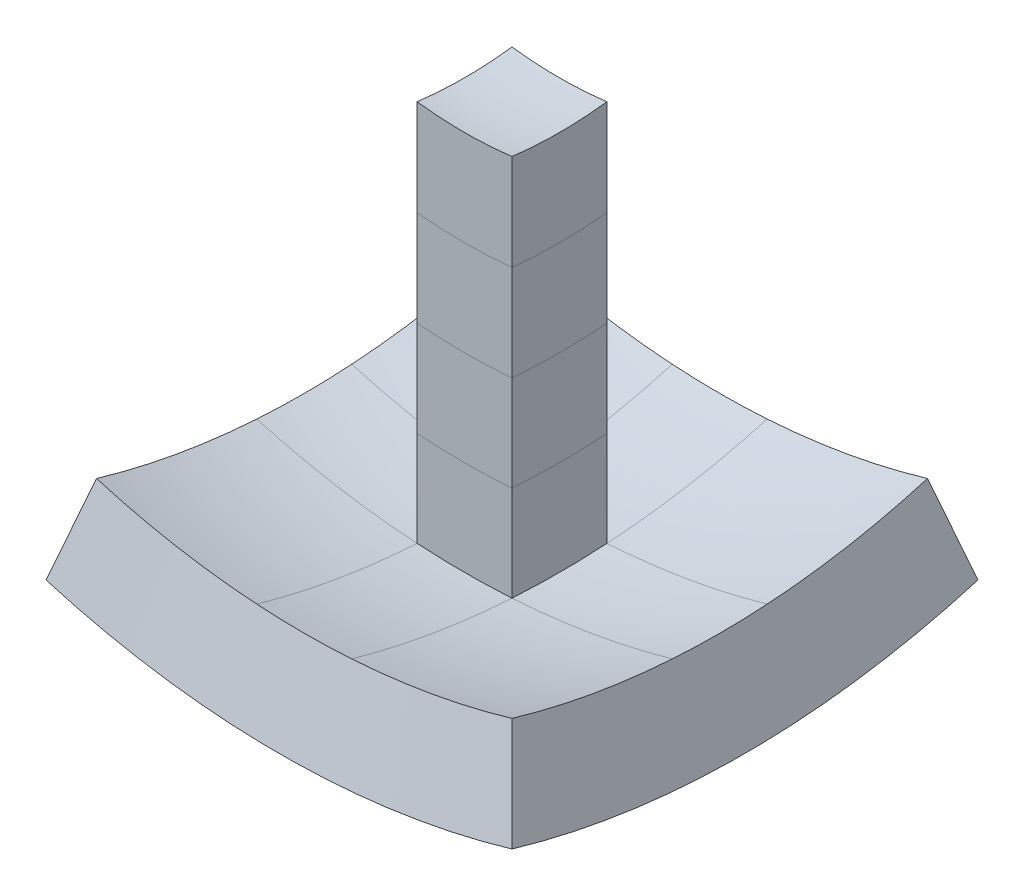
ISO-10303-21;
HEADER;
FILE_DESCRIPTION(('STEP AP214'),'2;1');
FILE_NAME('part.step','',(''),(''),'','','');
FILE_SCHEMA(('AUTOMOTIVE_DESIGN { 1 0 10303 214 1 1 1 1 }'));
ENDSEC;
DATA;
#1=APPLICATION_CONTEXT('core data for automotive mechanical design processes');
#2=APPLICATION_PROTOCOL_DEFINITION('international standard','automotive_design',2000,#1);
#3=PRODUCT_CONTEXT('',#1,'mechanical');
#4=PRODUCT('Part','Part','',(#3));
#5=PRODUCT_RELATED_PRODUCT_CATEGORY('part','',(#4));
#6=PRODUCT_DEFINITION_FORMATION('','',#4);
#7=PRODUCT_DEFINITION_CONTEXT('part definition',#1,'design');
#8=PRODUCT_DEFINITION('design','',#6,#7);
#9=PRODUCT_DEFINITION_SHAPE('','',#8);
#10=(LENGTH_UNIT() NAMED_UNIT(*) SI_UNIT(.MILLI.,.METRE.));
#11=(NAMED_UNIT(*) PLANE_ANGLE_UNIT() SI_UNIT($,.RADIAN.));
#12=(NAMED_UNIT(*) SI_UNIT($,.STERADIAN.) SOLID_ANGLE_UNIT());
#13=UNCERTAINTY_MEASURE_WITH_UNIT(LENGTH_MEASURE(1.E-05),#10,'distance_accuracy_value','');
#14=(GEOMETRIC_REPRESENTATION_CONTEXT(3) GLOBAL_UNCERTAINTY_ASSIGNED_CONTEXT((#13)) GLOBAL_UNIT_ASSIGNED_CONTEXT((#10,
#11,#12)) REPRESENTATION_CONTEXT('',''));
#15=CARTESIAN_POINT('',(0.,0.,0.));
#16=DIRECTION('',(0.,0.,1.));
#17=DIRECTION('',(1.,0.,0.));
#18=AXIS2_PLACEMENT_3D('',#15,#16,#17);
#19=CARTESIAN_POINT('',(0.,0.,0.));
#20=DIRECTION('',(0.,0.,1.));
#21=DIRECTION('',(1.,0.,0.));
#22=AXIS2_PLACEMENT_3D('',#19,#20,#21);
#23=SPHERICAL_SURFACE('',#22,30.7476736735782);
#24=CARTESIAN_POINT('',(0.,0.,3.8947960584419));
#25=DIRECTION('',(0.,0.,1.));
#26=DIRECTION('',(-1.,0.,0.));
#27=AXIS2_PLACEMENT_3D('',#24,#25,#26);
#28=CIRCLE('',#27,30.5);
#29=CARTESIAN_POINT('',(-8.39306295221711,-29.3224571664811,3.8947960584418));
#30=VERTEX_POINT('',#29);
#31=CARTESIAN_POINT('',(-3.89479605844179,-30.2502985714711,3.8947960584418));
#32=VERTEX_POINT('',#31);
#33=EDGE_CURVE('E314',#30,#32,#28,.T.);
#34=ORIENTED_EDGE('',*,*,#33,.T.);
#35=CARTESIAN_POINT('',(-3.8947960584419,0.,0.));
#36=DIRECTION('',(-1.,0.,0.));
#37=DIRECTION('',(0.,-1.,0.));
#38=AXIS2_PLACEMENT_3D('',#35,#36,#37);
#39=CIRCLE('',#38,30.5);
#40=CARTESIAN_POINT('',(-3.8947960584418,-29.3224571664811,8.39306295221711));
#41=VERTEX_POINT('',#40);
#42=EDGE_CURVE('E49',#32,#41,#39,.T.);
#43=ORIENTED_EDGE('',*,*,#42,.T.);
#44=CARTESIAN_POINT('',(0.,0.,8.39306295221721));
#45=DIRECTION('',(0.,0.,1.));
#46=DIRECTION('',(-1.,0.,0.));
#47=AXIS2_PLACEMENT_3D('',#44,#45,#46);
#48=CIRCLE('',#47,29.5799920658706);
#49=CARTESIAN_POINT('',(-8.39306295221712,-28.3642807928756,8.39306295221711));
#50=VERTEX_POINT('',#49);
#51=EDGE_CURVE('E113',#50,#41,#48,.T.);
#52=ORIENTED_EDGE('',*,*,#51,.F.);
#53=CARTESIAN_POINT('',(-8.39306295221722,0.,0.));
#54=DIRECTION('',(1.,0.,0.));
#55=DIRECTION('',(0.,1.,0.));
#56=AXIS2_PLACEMENT_3D('',#53,#54,#55);
#57=CIRCLE('',#56,29.5799920658707);
#58=EDGE_CURVE('E127',#50,#30,#57,.T.);
#59=ORIENTED_EDGE('',*,*,#58,.T.);
#60=EDGE_LOOP('',(#34,#43,#52,#59));
#61=FACE_BOUND('',#60,.T.);
#62=ADVANCED_FACE('F37',(#61),#23,.T.);
#63=CARTESIAN_POINT('',(32.5,0.,3.894796058442));
#64=DIRECTION('',(0.,0.,1.));
#65=DIRECTION('',(-1.,0.,0.));
#66=AXIS2_PLACEMENT_3D('',#63,#64,#65);
#67=PLANE('',#66);
#68=DIRECTION('',(-1.,0.,0.));
#69=VECTOR('',#68,1.);
#70=CARTESIAN_POINT('',(-32.5,-32.5,3.89479605844188));
#71=LINE('',#70,#69);
#72=CARTESIAN_POINT('',(3.8947960584421,-32.5,3.8947960584418));
#73=VERTEX_POINT('',#72);
#74=CARTESIAN_POINT('',(-3.89479605844188,-32.5,3.8947960584418));
#75=VERTEX_POINT('',#74);
#76=EDGE_CURVE('E616',#73,#75,#71,.T.);
#77=ORIENTED_EDGE('',*,*,#76,.F.);
#78=DIRECTION('',(0.,1.,0.));
#79=VECTOR('',#78,1.);
#80=CARTESIAN_POINT('',(3.89479605844199,-1.07552855510562E-13,3.89479605844199));
#81=LINE('',#80,#79);
#82=CARTESIAN_POINT('',(3.894796058442,-30.250298571471,3.8947960584418));
#83=VERTEX_POINT('',#82);
#84=EDGE_CURVE('E480',#73,#83,#81,.T.);
#85=ORIENTED_EDGE('',*,*,#84,.T.);
#86=EDGE_CURVE('E315',#32,#83,#28,.T.);
#87=ORIENTED_EDGE('',*,*,#86,.F.);
#88=DIRECTION('',(0.,-1.,0.));
#89=VECTOR('',#88,1.);
#90=CARTESIAN_POINT('',(-3.89479605844199,-1.45716771982052E-13,3.89479605844199));
#91=LINE('',#90,#89);
#92=EDGE_CURVE('E139',#32,#75,#91,.T.);
#93=ORIENTED_EDGE('',*,*,#92,.T.);
#94=EDGE_LOOP('',(#77,#85,#87,#93));
#95=FACE_BOUND('',#94,.T.);
#96=ADVANCED_FACE('F250',(#95),#67,.T.);
#97=CARTESIAN_POINT('',(3.89479605844189,32.5,0.));
#98=DIRECTION('',(1.,0.,0.));
#99=DIRECTION('',(0.,-1.,0.));
#100=AXIS2_PLACEMENT_3D('',#97,#98,#99);
#101=PLANE('',#100);
#102=DIRECTION('',(0.,0.,1.));
#103=VECTOR('',#102,1.);
#104=CARTESIAN_POINT('',(3.8947960584421,-32.5,-32.5));
#105=LINE('',#104,#103);
#106=CARTESIAN_POINT('',(3.89479605844201,-32.5,-3.89479605844211));
#107=VERTEX_POINT('',#106);
#108=EDGE_CURVE('E544',#107,#73,#105,.T.);
#109=ORIENTED_EDGE('',*,*,#108,.F.);
#110=DIRECTION('',(0.,-1.,0.));
#111=VECTOR('',#110,1.);
#112=CARTESIAN_POINT('',(3.89479605844199,0.,-3.89479605844199));
#113=LINE('',#112,#111);
#114=CARTESIAN_POINT('',(3.894796058442,-30.250298571471,-3.89479605844201));
#115=VERTEX_POINT('',#114);
#116=EDGE_CURVE('E404',#115,#107,#113,.T.);
#117=ORIENTED_EDGE('',*,*,#116,.F.);
#118=CARTESIAN_POINT('',(3.8947960584419,0.,0.));
#119=DIRECTION('',(-1.,0.,0.));
#120=DIRECTION('',(0.,-1.,0.));
#121=AXIS2_PLACEMENT_3D('',#118,#119,#120);
#122=CIRCLE('',#121,30.5);
#123=EDGE_CURVE('E142',#115,#83,#122,.T.);
#124=ORIENTED_EDGE('',*,*,#123,.T.);
#125=ORIENTED_EDGE('',*,*,#84,.F.);
#126=EDGE_LOOP('',(#109,#117,#124,#125));
#127=FACE_BOUND('',#126,.T.);
#128=ADVANCED_FACE('F258',(#127),#101,.T.);
#129=ORIENTED_EDGE('',*,*,#42,.F.);
#130=ORIENTED_EDGE('',*,*,#86,.T.);
#131=CARTESIAN_POINT('',(3.894796058442,-29.3224571664811,8.39306295221711));
#132=VERTEX_POINT('',#131);
#133=EDGE_CURVE('E134',#83,#132,#122,.T.);
#134=ORIENTED_EDGE('',*,*,#133,.T.);
#135=EDGE_CURVE('E57',#41,#132,#48,.T.);
#136=ORIENTED_EDGE('',*,*,#135,.F.);
#137=EDGE_LOOP('',(#129,#130,#134,#136));
#138=FACE_BOUND('',#137,.T.);
#139=ADVANCED_FACE('F264',(#138),#23,.T.);
#140=CARTESIAN_POINT('',(-3.89479605844211,32.5,0.));
#141=DIRECTION('',(-1.,0.,0.));
#142=DIRECTION('',(0.,-1.,0.));
#143=AXIS2_PLACEMENT_3D('',#140,#141,#142);
#144=PLANE('',#143);
#145=DIRECTION('',(0.,0.,-1.));
#146=VECTOR('',#145,1.);
#147=CARTESIAN_POINT('',(-3.89479605844188,-32.5,-32.5));
#148=LINE('',#147,#146);
#149=CARTESIAN_POINT('',(-3.89479605844183,-32.5,-3.89479605844211));
#150=VERTEX_POINT('',#149);
#151=EDGE_CURVE('E545',#75,#150,#148,.T.);
#152=ORIENTED_EDGE('',*,*,#151,.F.);
#153=ORIENTED_EDGE('',*,*,#92,.F.);
#154=CARTESIAN_POINT('',(-3.89479605844188,-30.250298571471,-3.89479605844201));
#155=VERTEX_POINT('',#154);
#156=EDGE_CURVE('E11',#155,#32,#39,.T.);
#157=ORIENTED_EDGE('',*,*,#156,.F.);
#158=DIRECTION('',(0.,1.,0.));
#159=VECTOR('',#158,1.);
#160=CARTESIAN_POINT('',(-3.89479605844199,-1.21430643318376E-13,-3.89479605844199));
#161=LINE('',#160,#159);
#162=EDGE_CURVE('E406',#150,#155,#161,.T.);
#163=ORIENTED_EDGE('',*,*,#162,.F.);
#164=EDGE_LOOP('',(#152,#153,#157,#163));
#165=FACE_BOUND('',#164,.T.);
#166=ADVANCED_FACE('F261',(#165),#144,.T.);
#167=CARTESIAN_POINT('',(0.,0.,0.));
#168=DIRECTION('',(-1.,0.,0.));
#169=DIRECTION('',(0.,1.,0.));
#170=AXIS2_PLACEMENT_3D('',#167,#168,#169);
#171=SPHERICAL_SURFACE('',#170,30.7476736735782);
#172=CARTESIAN_POINT('',(0.,0.,-3.8947960584419));
#173=DIRECTION('',(0.,0.,1.));
#174=DIRECTION('',(-1.,0.,0.));
#175=AXIS2_PLACEMENT_3D('',#172,#173,#174);
#176=CIRCLE('',#175,30.5);
#177=CARTESIAN_POINT('',(-8.39306295221711,-29.3224571664811,-3.894796058442));
#178=VERTEX_POINT('',#177);
#179=EDGE_CURVE('E329',#178,#155,#176,.T.);
#180=ORIENTED_EDGE('',*,*,#179,.T.);
#181=ORIENTED_EDGE('',*,*,#156,.T.);
#182=ORIENTED_EDGE('',*,*,#33,.F.);
#183=CARTESIAN_POINT('',(-8.39306295221721,0.,0.));
#184=DIRECTION('',(-1.,0.,0.));
#185=DIRECTION('',(0.,-1.,0.));
#186=AXIS2_PLACEMENT_3D('',#183,#184,#185);
#187=CIRCLE('',#186,29.5799920658706);
#188=EDGE_CURVE('E47',#178,#30,#187,.T.);
#189=ORIENTED_EDGE('',*,*,#188,.F.);
#190=EDGE_LOOP('',(#180,#181,#182,#189));
#191=FACE_BOUND('',#190,.T.);
#192=ADVANCED_FACE('F207',(#191),#171,.T.);
#193=CARTESIAN_POINT('',(32.5,0.,-3.894796058442));
#194=DIRECTION('',(0.,0.,-1.));
#195=DIRECTION('',(-1.,0.,0.));
#196=AXIS2_PLACEMENT_3D('',#193,#194,#195);
#197=PLANE('',#196);
#198=DIRECTION('',(1.,0.,0.));
#199=VECTOR('',#198,1.);
#200=CARTESIAN_POINT('',(-32.5,-32.5,-3.8947960584421));
#201=LINE('',#200,#199);
#202=EDGE_CURVE('E356',#150,#107,#201,.T.);
#203=ORIENTED_EDGE('',*,*,#202,.F.);
#204=ORIENTED_EDGE('',*,*,#162,.T.);
#205=EDGE_CURVE('E326',#155,#115,#176,.T.);
#206=ORIENTED_EDGE('',*,*,#205,.T.);
#207=ORIENTED_EDGE('',*,*,#116,.T.);
#208=EDGE_LOOP('',(#203,#204,#206,#207));
#209=FACE_BOUND('',#208,.T.);
#210=ADVANCED_FACE('F255',(#209),#197,.T.);
#211=CARTESIAN_POINT('',(0.,0.,0.));
#212=DIRECTION('',(1.,0.,0.));
#213=DIRECTION('',(0.,1.,0.));
#214=AXIS2_PLACEMENT_3D('',#211,#212,#213);
#215=SPHERICAL_SURFACE('',#214,30.7476736735782);
#216=CARTESIAN_POINT('',(8.39306295221732,-29.322457166481,-3.89479605844201));
#217=VERTEX_POINT('',#216);
#218=EDGE_CURVE('E330',#115,#217,#176,.T.);
#219=ORIENTED_EDGE('',*,*,#218,.T.);
#220=CARTESIAN_POINT('',(8.39306295221721,0.,0.));
#221=DIRECTION('',(-1.,0.,0.));
#222=DIRECTION('',(0.,-1.,0.));
#223=AXIS2_PLACEMENT_3D('',#220,#221,#222);
#224=CIRCLE('',#223,29.5799920658706);
#225=CARTESIAN_POINT('',(8.3930629522173,-29.322457166481,3.8947960584418));
#226=VERTEX_POINT('',#225);
#227=EDGE_CURVE('E307',#217,#226,#224,.T.);
#228=ORIENTED_EDGE('',*,*,#227,.T.);
#229=EDGE_CURVE('E122',#83,#226,#28,.T.);
#230=ORIENTED_EDGE('',*,*,#229,.F.);
#231=ORIENTED_EDGE('',*,*,#123,.F.);
#232=EDGE_LOOP('',(#219,#228,#230,#231));
#233=FACE_BOUND('',#232,.T.);
#234=ADVANCED_FACE('F233',(#233),#215,.T.);
#235=CARTESIAN_POINT('',(0.,0.,0.));
#236=DIRECTION('',(0.,0.,-1.));
#237=DIRECTION('',(1.,0.,0.));
#238=AXIS2_PLACEMENT_3D('',#235,#236,#237);
#239=SPHERICAL_SURFACE('',#238,30.7476736735782);
#240=ORIENTED_EDGE('',*,*,#205,.F.);
#241=CARTESIAN_POINT('',(-3.89479605844199,0.,0.));
#242=DIRECTION('',(-1.,0.,0.));
#243=DIRECTION('',(0.,-1.,0.));
#244=AXIS2_PLACEMENT_3D('',#241,#242,#243);
#245=CIRCLE('',#244,30.5);
#246=CARTESIAN_POINT('',(-3.89479605844189,-29.322457166481,-8.39306295221732));
#247=VERTEX_POINT('',#246);
#248=EDGE_CURVE('E179',#155,#247,#245,.F.);
#249=ORIENTED_EDGE('',*,*,#248,.T.);
#250=CARTESIAN_POINT('',(0.,0.,-8.39306295221721));
#251=DIRECTION('',(0.,0.,1.));
#252=DIRECTION('',(-1.,0.,0.));
#253=AXIS2_PLACEMENT_3D('',#250,#251,#252);
#254=CIRCLE('',#253,29.5799920658706);
#255=CARTESIAN_POINT('',(3.894796058442,-29.322457166481,-8.39306295221732));
#256=VERTEX_POINT('',#255);
#257=EDGE_CURVE('E85',#247,#256,#254,.T.);
#258=ORIENTED_EDGE('',*,*,#257,.T.);
#259=EDGE_CURVE('E141',#256,#115,#122,.T.);
#260=ORIENTED_EDGE('',*,*,#259,.T.);
#261=EDGE_LOOP('',(#240,#249,#258,#260));
#262=FACE_BOUND('',#261,.T.);
#263=ADVANCED_FACE('F190',(#262),#239,.T.);
#264=CARTESIAN_POINT('',(0.,0.,7.48329222234973));
#265=DIRECTION('',(0.,0.,1.));
#266=DIRECTION('',(-1.,0.,0.));
#267=AXIS2_PLACEMENT_3D('',#264,#265,#266);
#268=CONICAL_SURFACE('',#267,26.2857240675938,1.30134475047002);
#269=CARTESIAN_POINT('',(0.,0.,7.48329222234973));
#270=DIRECTION('',(0.,0.,1.));
#271=DIRECTION('',(-1.,0.,0.));
#272=AXIS2_PLACEMENT_3D('',#269,#270,#271);
#273=CIRCLE('',#272,26.2857240675938);
#274=CARTESIAN_POINT('',(-7.48329222234964,-25.1980083989311,7.48329222234964));
#275=VERTEX_POINT('',#274);
#276=CARTESIAN_POINT('',(-1.70874488464016,-26.2301254415014,7.48329222234964));
#277=VERTEX_POINT('',#276);
#278=EDGE_CURVE('E317',#275,#277,#273,.T.);
#279=ORIENTED_EDGE('',*,*,#278,.F.);
#280=CARTESIAN_POINT('',(-7.48309222234964,-25.1973123361948,7.48309222234964));
#281=CARTESIAN_POINT('',(-7.63478675873763,-25.7252567580436,7.63478675873763));
#282=CARTESIAN_POINT('',(-7.78648158775392,-26.2532010117296,7.78648158775392));
#283=CARTESIAN_POINT('',(-8.08987183104308,-27.3090891827758,8.08987183104308));
#284=CARTESIAN_POINT('',(-8.24156724531595,-27.8370331001361,8.24156724531595));
#285=CARTESIAN_POINT('',(-8.39326295221711,-28.3649768493335,8.39326295221711));
#286=B_SPLINE_CURVE_WITH_KNOTS('',3,(#280,#281,#282,#283,#284,#285),.UNSPECIFIED.,.F.,.F.,(4,2,
4),(0.,1.70959936701711,3.41919873403409),.UNSPECIFIED.);
#287=EDGE_CURVE('E133',#275,#50,#286,.T.);
#288=ORIENTED_EDGE('',*,*,#287,.T.);
#289=ORIENTED_EDGE('',*,*,#51,.T.);
#290=ORIENTED_EDGE('',*,*,#135,.T.);
#291=CARTESIAN_POINT('',(8.39306295221731,-28.3642807928756,8.39306295221712));
#292=VERTEX_POINT('',#291);
#293=EDGE_CURVE('E104',#132,#292,#48,.T.);
#294=ORIENTED_EDGE('',*,*,#293,.T.);
#295=CARTESIAN_POINT('',(8.39326295221731,-28.3649768493335,8.39326295221712));
#296=CARTESIAN_POINT('',(8.24156724531615,-27.837033100136,8.24156724531596));
#297=CARTESIAN_POINT('',(8.08987183104328,-27.3090891827758,8.08987183104309));
#298=CARTESIAN_POINT('',(7.78648158775411,-26.2532010117296,7.78648158775393));
#299=CARTESIAN_POINT('',(7.63478675873782,-25.7252567580436,7.63478675873764));
#300=CARTESIAN_POINT('',(7.48309222234982,-25.1973123361948,7.48309222234965));
#301=B_SPLINE_CURVE_WITH_KNOTS('',3,(#295,#296,#297,#298,#299,#300),.UNSPECIFIED.,.F.,.F.,(4,2,
4),(0.,1.70959936701698,3.41919873403409),.UNSPECIFIED.);
#302=CARTESIAN_POINT('',(7.48329222234981,-25.1980083989311,7.48329222234964));
#303=VERTEX_POINT('',#302);
#304=EDGE_CURVE('E109',#292,#303,#301,.T.);
#305=ORIENTED_EDGE('',*,*,#304,.T.);
#306=CARTESIAN_POINT('',(1.70874488464034,-26.2301254415014,7.48329222234964));
#307=VERTEX_POINT('',#306);
#308=EDGE_CURVE('E94',#307,#303,#273,.T.);
#309=ORIENTED_EDGE('',*,*,#308,.F.);
#310=EDGE_CURVE('E319',#277,#307,#273,.T.);
#311=ORIENTED_EDGE('',*,*,#310,.F.);
#312=EDGE_LOOP('',(#279,#288,#289,#290,#294,#305,#309,#311));
#313=FACE_BOUND('',#312,.T.);
#314=ADVANCED_FACE('F107',(#313),#268,.F.);
#315=CARTESIAN_POINT('',(-7.48329222234973,0.,0.));
#316=DIRECTION('',(-1.,0.,0.));
#317=DIRECTION('',(0.,-1.,0.));
#318=AXIS2_PLACEMENT_3D('',#315,#316,#317);
#319=CONICAL_SURFACE('',#318,26.2857240675938,1.30134475047002);
#320=CARTESIAN_POINT('',(-8.39326295221711,-28.3649768493335,-8.39326295221731));
#321=CARTESIAN_POINT('',(-8.24156724531595,-27.837033100136,-8.24156724531614));
#322=CARTESIAN_POINT('',(-8.08987183104308,-27.3090891827758,-8.08987183104327));
#323=CARTESIAN_POINT('',(-7.78648158775392,-26.2532010117295,-7.78648158775411));
#324=CARTESIAN_POINT('',(-7.63478675873763,-25.7252567580436,-7.63478675873781));
#325=CARTESIAN_POINT('',(-7.48309222234963,-25.1973123361948,-7.48309222234981));
#326=B_SPLINE_CURVE_WITH_KNOTS('',3,(#320,#321,#322,#323,#324,#325),.UNSPECIFIED.,.F.,.F.,(4,2,
4),(0.,1.70959936701698,3.41919873403409),.UNSPECIFIED.);
#327=CARTESIAN_POINT('',(-8.39306295221712,-28.3642807928756,-8.39306295221731));
#328=VERTEX_POINT('',#327);
#329=CARTESIAN_POINT('',(-7.48329222234964,-25.1980083989311,-7.48329222234982));
#330=VERTEX_POINT('',#329);
#331=EDGE_CURVE('E178',#328,#330,#326,.T.);
#332=ORIENTED_EDGE('',*,*,#331,.F.);
#333=CARTESIAN_POINT('',(-8.39306295221722,0.,0.));
#334=DIRECTION('',(1.,0.,0.));
#335=DIRECTION('',(0.,1.,0.));
#336=AXIS2_PLACEMENT_3D('',#333,#334,#335);
#337=CIRCLE('',#336,29.5799920658707);
#338=EDGE_CURVE('E344',#178,#328,#337,.T.);
#339=ORIENTED_EDGE('',*,*,#338,.F.);
#340=ORIENTED_EDGE('',*,*,#188,.T.);
#341=ORIENTED_EDGE('',*,*,#58,.F.);
#342=ORIENTED_EDGE('',*,*,#287,.F.);
#343=CARTESIAN_POINT('',(-7.48329222234973,0.,0.));
#344=DIRECTION('',(-1.,0.,0.));
#345=DIRECTION('',(0.,-1.,0.));
#346=AXIS2_PLACEMENT_3D('',#343,#344,#345);
#347=CIRCLE('',#346,26.2857240675938);
#348=CARTESIAN_POINT('',(-7.48329222234963,-26.2301254415014,1.70874488464018));
#349=VERTEX_POINT('',#348);
#350=EDGE_CURVE('E325',#349,#275,#347,.T.);
#351=ORIENTED_EDGE('',*,*,#350,.F.);
#352=CARTESIAN_POINT('',(-7.48329222234964,-26.2301254415014,-1.70874488464036));
#353=VERTEX_POINT('',#352);
#354=EDGE_CURVE('E479',#353,#349,#347,.T.);
#355=ORIENTED_EDGE('',*,*,#354,.F.);
#356=CARTESIAN_POINT('',(-7.48329222234974,0.,0.));
#357=DIRECTION('',(1.,0.,0.));
#358=DIRECTION('',(0.,1.,0.));
#359=AXIS2_PLACEMENT_3D('',#356,#357,#358);
#360=CIRCLE('',#359,26.2857240675939);
#361=EDGE_CURVE('E348',#330,#353,#360,.F.);
#362=ORIENTED_EDGE('',*,*,#361,.F.);
#363=EDGE_LOOP('',(#332,#339,#340,#341,#342,#351,#355,#362));
#364=FACE_BOUND('',#363,.T.);
#365=ADVANCED_FACE('F164',(#364),#319,.F.);
#366=ORIENTED_EDGE('',*,*,#133,.F.);
#367=ORIENTED_EDGE('',*,*,#229,.T.);
#368=CARTESIAN_POINT('',(8.39306295221722,0.,0.));
#369=DIRECTION('',(-1.,0.,0.));
#370=DIRECTION('',(0.,-1.,0.));
#371=AXIS2_PLACEMENT_3D('',#368,#369,#370);
#372=CIRCLE('',#371,29.5799920658707);
#373=EDGE_CURVE('E118',#226,#292,#372,.T.);
#374=ORIENTED_EDGE('',*,*,#373,.T.);
#375=ORIENTED_EDGE('',*,*,#293,.F.);
#376=EDGE_LOOP('',(#366,#367,#374,#375));
#377=FACE_BOUND('',#376,.T.);
#378=ADVANCED_FACE('F119',(#377),#23,.T.);
#379=ORIENTED_EDGE('',*,*,#179,.F.);
#380=ORIENTED_EDGE('',*,*,#338,.T.);
#381=EDGE_CURVE('E331',#328,#247,#254,.T.);
#382=ORIENTED_EDGE('',*,*,#381,.T.);
#383=ORIENTED_EDGE('',*,*,#248,.F.);
#384=EDGE_LOOP('',(#379,#380,#382,#383));
#385=FACE_BOUND('',#384,.T.);
#386=ADVANCED_FACE('F163',(#385),#239,.T.);
#387=CARTESIAN_POINT('',(7.48329222234973,0.,0.));
#388=DIRECTION('',(1.,0.,0.));
#389=DIRECTION('',(0.,-1.,0.));
#390=AXIS2_PLACEMENT_3D('',#387,#388,#389);
#391=CONICAL_SURFACE('',#390,26.2857240675938,1.30134475047002);
#392=CARTESIAN_POINT('',(7.48309222234982,-25.1973123361948,-7.48309222234982));
#393=CARTESIAN_POINT('',(7.63478675873782,-25.7252567580435,-7.63478675873782));
#394=CARTESIAN_POINT('',(7.78648158775411,-26.2532010117295,-7.78648158775412));
#395=CARTESIAN_POINT('',(8.08987183104328,-27.3090891827757,-8.08987183104328));
#396=CARTESIAN_POINT('',(8.24156724531615,-27.837033100136,-8.24156724531615));
#397=CARTESIAN_POINT('',(8.39326295221731,-28.3649768493334,-8.39326295221732));
#398=B_SPLINE_CURVE_WITH_KNOTS('',3,(#392,#393,#394,#395,#396,#397),.UNSPECIFIED.,.F.,.F.,(4,2,
4),(0.,1.70959936701711,3.4191987340341),.UNSPECIFIED.);
#399=CARTESIAN_POINT('',(7.48329222234982,-25.198008398931,-7.48329222234982));
#400=VERTEX_POINT('',#399);
#401=CARTESIAN_POINT('',(8.39306295221731,-28.3642807928755,-8.39306295221732));
#402=VERTEX_POINT('',#401);
#403=EDGE_CURVE('E171',#400,#402,#398,.T.);
#404=ORIENTED_EDGE('',*,*,#403,.F.);
#405=CARTESIAN_POINT('',(7.48329222234973,0.,0.));
#406=DIRECTION('',(-1.,0.,0.));
#407=DIRECTION('',(0.,-1.,0.));
#408=AXIS2_PLACEMENT_3D('',#405,#406,#407);
#409=CIRCLE('',#408,26.2857240675938);
#410=CARTESIAN_POINT('',(7.48329222234982,-26.2301254415013,-1.70874488464036));
#411=VERTEX_POINT('',#410);
#412=EDGE_CURVE('E305',#411,#400,#409,.F.);
#413=ORIENTED_EDGE('',*,*,#412,.F.);
#414=CARTESIAN_POINT('',(7.48329222234973,0.,0.));
#415=DIRECTION('',(-1.,0.,0.));
#416=DIRECTION('',(0.,-1.,0.));
#417=AXIS2_PLACEMENT_3D('',#414,#415,#416);
#418=CIRCLE('',#417,26.2857240675938);
#419=CARTESIAN_POINT('',(7.48329222234982,-26.2301254415013,1.70874488464018));
#420=VERTEX_POINT('',#419);
#421=EDGE_CURVE('E295',#411,#420,#418,.T.);
#422=ORIENTED_EDGE('',*,*,#421,.T.);
#423=EDGE_CURVE('E132',#420,#303,#418,.T.);
#424=ORIENTED_EDGE('',*,*,#423,.T.);
#425=ORIENTED_EDGE('',*,*,#304,.F.);
#426=ORIENTED_EDGE('',*,*,#373,.F.);
#427=ORIENTED_EDGE('',*,*,#227,.F.);
#428=CARTESIAN_POINT('',(8.39306295221722,0.,0.));
#429=DIRECTION('',(-1.,0.,0.));
#430=DIRECTION('',(0.,-1.,0.));
#431=AXIS2_PLACEMENT_3D('',#428,#429,#430);
#432=CIRCLE('',#431,29.5799920658707);
#433=EDGE_CURVE('E343',#402,#217,#432,.T.);
#434=ORIENTED_EDGE('',*,*,#433,.F.);
#435=EDGE_LOOP('',(#404,#413,#422,#424,#425,#426,#427,#434));
#436=FACE_BOUND('',#435,.T.);
#437=ADVANCED_FACE('F130',(#436),#391,.F.);
#438=CARTESIAN_POINT('',(0.,0.,0.));
#439=DIRECTION('',(0.,0.,1.));
#440=DIRECTION('',(1.,0.,0.));
#441=AXIS2_PLACEMENT_3D('',#438,#439,#440);
#442=SPHERICAL_SURFACE('',#441,27.3301839042982);
#443=CARTESIAN_POINT('',(0.,0.,1.70874488464027));
#444=DIRECTION('',(0.,0.,1.));
#445=DIRECTION('',(-1.,0.,0.));
#446=AXIS2_PLACEMENT_3D('',#443,#444,#445);
#447=CIRCLE('',#446,27.276714302899);
#448=CARTESIAN_POINT('',(-1.70874488464016,-27.2231396808155,1.70874488464017));
#449=VERTEX_POINT('',#448);
#450=EDGE_CURVE('E301',#349,#449,#447,.T.);
#451=ORIENTED_EDGE('',*,*,#450,.F.);
#452=ORIENTED_EDGE('',*,*,#350,.T.);
#453=ORIENTED_EDGE('',*,*,#278,.T.);
#454=CARTESIAN_POINT('',(-1.70874488464026,0.,0.));
#455=DIRECTION('',(-1.,0.,0.));
#456=DIRECTION('',(0.,-1.,0.));
#457=AXIS2_PLACEMENT_3D('',#454,#455,#456);
#458=CIRCLE('',#457,27.2767143028991);
#459=EDGE_CURVE('E293',#449,#277,#458,.T.);
#460=ORIENTED_EDGE('',*,*,#459,.F.);
#461=EDGE_LOOP('',(#451,#452,#453,#460));
#462=FACE_BOUND('',#461,.T.);
#463=ADVANCED_FACE('F162',(#462),#442,.F.);
#464=ORIENTED_EDGE('',*,*,#423,.F.);
#465=CARTESIAN_POINT('',(1.70874488464035,-27.2231396808155,1.70874488464017));
#466=VERTEX_POINT('',#465);
#467=EDGE_CURVE('E289',#466,#420,#447,.T.);
#468=ORIENTED_EDGE('',*,*,#467,.F.);
#469=CARTESIAN_POINT('',(1.70874488464026,0.,0.));
#470=DIRECTION('',(1.,0.,0.));
#471=DIRECTION('',(0.,1.,0.));
#472=AXIS2_PLACEMENT_3D('',#469,#470,#471);
#473=CIRCLE('',#472,27.2767143028991);
#474=EDGE_CURVE('E137',#307,#466,#473,.T.);
#475=ORIENTED_EDGE('',*,*,#474,.F.);
#476=ORIENTED_EDGE('',*,*,#308,.T.);
#477=EDGE_LOOP('',(#464,#468,#475,#476));
#478=FACE_BOUND('',#477,.T.);
#479=ADVANCED_FACE('F274',(#478),#442,.F.);
#480=EDGE_CURVE('E126',#449,#466,#447,.T.);
#481=ORIENTED_EDGE('',*,*,#480,.F.);
#482=ORIENTED_EDGE('',*,*,#459,.T.);
#483=ORIENTED_EDGE('',*,*,#310,.T.);
#484=ORIENTED_EDGE('',*,*,#474,.T.);
#485=EDGE_LOOP('',(#481,#482,#483,#484));
#486=FACE_BOUND('',#485,.T.);
#487=ADVANCED_FACE('F167',(#486),#442,.F.);
#488=CARTESIAN_POINT('',(0.,0.,-7.48329222234973));
#489=DIRECTION('',(0.,0.,-1.));
#490=DIRECTION('',(-1.,0.,0.));
#491=AXIS2_PLACEMENT_3D('',#488,#489,#490);
#492=CONICAL_SURFACE('',#491,26.2857240675938,1.30134475047002);
#493=ORIENTED_EDGE('',*,*,#381,.F.);
#494=ORIENTED_EDGE('',*,*,#331,.T.);
#495=CARTESIAN_POINT('',(0.,0.,-7.48329222234973));
#496=DIRECTION('',(0.,0.,1.));
#497=DIRECTION('',(-1.,0.,0.));
#498=AXIS2_PLACEMENT_3D('',#495,#496,#497);
#499=CIRCLE('',#498,26.2857240675938);
#500=CARTESIAN_POINT('',(-1.70874488464016,-26.2301254415013,-7.48329222234982));
#501=VERTEX_POINT('',#500);
#502=EDGE_CURVE('E337',#330,#501,#499,.T.);
#503=ORIENTED_EDGE('',*,*,#502,.T.);
#504=CARTESIAN_POINT('',(1.70874488464034,-26.2301254415013,-7.48329222234982));
#505=VERTEX_POINT('',#504);
#506=EDGE_CURVE('E333',#501,#505,#499,.T.);
#507=ORIENTED_EDGE('',*,*,#506,.T.);
#508=EDGE_CURVE('E338',#505,#400,#499,.T.);
#509=ORIENTED_EDGE('',*,*,#508,.T.);
#510=ORIENTED_EDGE('',*,*,#403,.T.);
#511=EDGE_CURVE('E81',#256,#402,#254,.T.);
#512=ORIENTED_EDGE('',*,*,#511,.F.);
#513=ORIENTED_EDGE('',*,*,#257,.F.);
#514=EDGE_LOOP('',(#493,#494,#503,#507,#509,#510,#512,#513));
#515=FACE_BOUND('',#514,.T.);
#516=ADVANCED_FACE('F165',(#515),#492,.F.);
#517=ORIENTED_EDGE('',*,*,#259,.F.);
#518=ORIENTED_EDGE('',*,*,#511,.T.);
#519=ORIENTED_EDGE('',*,*,#433,.T.);
#520=ORIENTED_EDGE('',*,*,#218,.F.);
#521=EDGE_LOOP('',(#517,#518,#519,#520));
#522=FACE_BOUND('',#521,.T.);
#523=ADVANCED_FACE('F189',(#522),#239,.T.);
#524=CARTESIAN_POINT('',(0.,0.,0.));
#525=DIRECTION('',(-1.,0.,0.));
#526=DIRECTION('',(0.,1.,0.));
#527=AXIS2_PLACEMENT_3D('',#524,#525,#526);
#528=SPHERICAL_SURFACE('',#527,27.3301839042982);
#529=CARTESIAN_POINT('',(0.,0.,-1.70874488464027));
#530=DIRECTION('',(0.,0.,1.));
#531=DIRECTION('',(-1.,0.,0.));
#532=AXIS2_PLACEMENT_3D('',#529,#530,#531);
#533=CIRCLE('',#532,27.276714302899);
#534=CARTESIAN_POINT('',(-1.70874488464016,-27.2231396808155,-1.70874488464036));
#535=VERTEX_POINT('',#534);
#536=EDGE_CURVE('E339',#353,#535,#533,.T.);
#537=ORIENTED_EDGE('',*,*,#536,.F.);
#538=ORIENTED_EDGE('',*,*,#354,.T.);
#539=ORIENTED_EDGE('',*,*,#450,.T.);
#540=CARTESIAN_POINT('',(-1.70874488464027,0.,0.));
#541=DIRECTION('',(-1.,0.,0.));
#542=DIRECTION('',(0.,-1.,0.));
#543=AXIS2_PLACEMENT_3D('',#540,#541,#542);
#544=CIRCLE('',#543,27.276714302899);
#545=EDGE_CURVE('E477',#535,#449,#544,.T.);
#546=ORIENTED_EDGE('',*,*,#545,.F.);
#547=EDGE_LOOP('',(#537,#538,#539,#546));
#548=FACE_BOUND('',#547,.T.);
#549=ADVANCED_FACE('F191',(#548),#528,.F.);
#550=CARTESIAN_POINT('',(0.,0.,0.));
#551=DIRECTION('',(0.,0.,-1.));
#552=DIRECTION('',(1.,0.,0.));
#553=AXIS2_PLACEMENT_3D('',#550,#551,#552);
#554=SPHERICAL_SURFACE('',#553,27.3301839042982);
#555=CARTESIAN_POINT('',(-1.70874488464026,0.,0.));
#556=DIRECTION('',(-1.,0.,0.));
#557=DIRECTION('',(0.,-1.,0.));
#558=AXIS2_PLACEMENT_3D('',#555,#556,#557);
#559=CIRCLE('',#558,27.2767143028991);
#560=EDGE_CURVE('E384',#501,#535,#559,.T.);
#561=ORIENTED_EDGE('',*,*,#560,.F.);
#562=ORIENTED_EDGE('',*,*,#502,.F.);
#563=ORIENTED_EDGE('',*,*,#361,.T.);
#564=ORIENTED_EDGE('',*,*,#536,.T.);
#565=EDGE_LOOP('',(#561,#562,#563,#564));
#566=FACE_BOUND('',#565,.T.);
#567=ADVANCED_FACE('F195',(#566),#554,.F.);
#568=CARTESIAN_POINT('',(1.70874488464026,0.,0.));
#569=DIRECTION('',(1.,0.,0.));
#570=DIRECTION('',(0.,1.,0.));
#571=AXIS2_PLACEMENT_3D('',#568,#569,#570);
#572=CIRCLE('',#571,27.2767143028991);
#573=CARTESIAN_POINT('',(1.70874488464035,-27.2231396808155,-1.70874488464036));
#574=VERTEX_POINT('',#573);
#575=EDGE_CURVE('E386',#574,#505,#572,.T.);
#576=ORIENTED_EDGE('',*,*,#575,.F.);
#577=EDGE_CURVE('E336',#574,#411,#533,.T.);
#578=ORIENTED_EDGE('',*,*,#577,.T.);
#579=ORIENTED_EDGE('',*,*,#412,.T.);
#580=ORIENTED_EDGE('',*,*,#508,.F.);
#581=EDGE_LOOP('',(#576,#578,#579,#580));
#582=FACE_BOUND('',#581,.T.);
#583=ADVANCED_FACE('F203',(#582),#554,.F.);
#584=CARTESIAN_POINT('',(0.,0.,0.));
#585=DIRECTION('',(1.,0.,0.));
#586=DIRECTION('',(0.,1.,0.));
#587=AXIS2_PLACEMENT_3D('',#584,#585,#586);
#588=SPHERICAL_SURFACE('',#587,27.3301839042982);
#589=ORIENTED_EDGE('',*,*,#577,.F.);
#590=CARTESIAN_POINT('',(1.70874488464027,0.,0.));
#591=DIRECTION('',(-1.,0.,0.));
#592=DIRECTION('',(0.,-1.,0.));
#593=AXIS2_PLACEMENT_3D('',#590,#591,#592);
#594=CIRCLE('',#593,27.276714302899);
#595=EDGE_CURVE('E300',#574,#466,#594,.T.);
#596=ORIENTED_EDGE('',*,*,#595,.T.);
#597=ORIENTED_EDGE('',*,*,#467,.T.);
#598=ORIENTED_EDGE('',*,*,#421,.F.);
#599=EDGE_LOOP('',(#589,#596,#597,#598));
#600=FACE_BOUND('',#599,.T.);
#601=ADVANCED_FACE('F197',(#600),#588,.F.);
#602=ORIENTED_EDGE('',*,*,#506,.F.);
#603=ORIENTED_EDGE('',*,*,#560,.T.);
#604=EDGE_CURVE('E342',#535,#574,#533,.T.);
#605=ORIENTED_EDGE('',*,*,#604,.T.);
#606=ORIENTED_EDGE('',*,*,#575,.T.);
#607=EDGE_LOOP('',(#602,#603,#605,#606));
#608=FACE_BOUND('',#607,.T.);
#609=ADVANCED_FACE('F198',(#608),#554,.F.);
#610=CARTESIAN_POINT('',(20.4238486312594,0.,-1.70874488464022));
#611=DIRECTION('',(0.,0.,-1.));
#612=DIRECTION('',(-1.,0.,0.));
#613=AXIS2_PLACEMENT_3D('',#610,#611,#612);
#614=PLANE('',#613);
#615=CARTESIAN_POINT('',(0.,0.,-1.70874488464022));
#616=DIRECTION('',(0.,0.,-1.));
#617=DIRECTION('',(0.,1.,0.));
#618=AXIS2_PLACEMENT_3D('',#615,#616,#617);
#619=CIRCLE('',#618,13.5529307992138);
#620=CARTESIAN_POINT('',(1.70874488464026,-13.4447805548285,-1.70874488464027));
#621=VERTEX_POINT('',#620);
#622=CARTESIAN_POINT('',(-1.70874488464017,-13.4447805548285,-1.7087448846403));
#623=VERTEX_POINT('',#622);
#624=EDGE_CURVE('E593',#621,#623,#619,.T.);
#625=ORIENTED_EDGE('',*,*,#624,.F.);
#626=DIRECTION('',(0.,-1.,0.));
#627=VECTOR('',#626,1.);
#628=CARTESIAN_POINT('',(1.70874488464022,0.,-1.70874488464022));
#629=LINE('',#628,#627);
#630=CARTESIAN_POINT('',(1.70874488464028,-16.9058781989141,-1.70874488464028));
#631=VERTEX_POINT('',#630);
#632=EDGE_CURVE('E357',#621,#631,#629,.T.);
#633=ORIENTED_EDGE('',*,*,#632,.T.);
#634=CARTESIAN_POINT('',(0.,0.,-1.70874488464022));
#635=DIRECTION('',(0.,0.,-1.));
#636=DIRECTION('',(0.,1.,0.));
#637=AXIS2_PLACEMENT_3D('',#634,#635,#636);
#638=CIRCLE('',#637,16.9920136169114);
#639=CARTESIAN_POINT('',(-1.70874488464011,-16.9058781989141,-1.70874488464023));
#640=VERTEX_POINT('',#639);
#641=EDGE_CURVE('E369',#640,#631,#638,.F.);
#642=ORIENTED_EDGE('',*,*,#641,.F.);
#643=DIRECTION('',(0.,1.,0.));
#644=VECTOR('',#643,1.);
#645=CARTESIAN_POINT('',(-1.70874488464022,0.,-1.70874488464025));
#646=LINE('',#645,#644);
#647=EDGE_CURVE('E372',#640,#623,#646,.T.);
#648=ORIENTED_EDGE('',*,*,#647,.T.);
#649=EDGE_LOOP('',(#625,#633,#642,#648));
#650=FACE_BOUND('',#649,.T.);
#651=ADVANCED_FACE('F201',(#650),#614,.T.);
#652=CARTESIAN_POINT('',(1.70874488464015,20.4238486312594,0.));
#653=DIRECTION('',(1.,0.,0.));
#654=DIRECTION('',(0.,-1.,0.));
#655=AXIS2_PLACEMENT_3D('',#652,#653,#654);
#656=PLANE('',#655);
#657=CARTESIAN_POINT('',(1.70874488464022,0.,0.));
#658=DIRECTION('',(1.,0.,0.));
#659=DIRECTION('',(0.,1.,0.));
#660=AXIS2_PLACEMENT_3D('',#657,#658,#659);
#661=CIRCLE('',#660,13.5529307992138);
#662=CARTESIAN_POINT('',(1.70874488464026,-13.4447805548285,1.70874488464017));
#663=VERTEX_POINT('',#662);
#664=EDGE_CURVE('E615',#663,#621,#661,.T.);
#665=ORIENTED_EDGE('',*,*,#664,.F.);
#666=DIRECTION('',(0.,1.,0.));
#667=VECTOR('',#666,1.);
#668=CARTESIAN_POINT('',(1.70874488464022,0.,1.70874488464026));
#669=LINE('',#668,#667);
#670=CARTESIAN_POINT('',(1.70874488464027,-16.9058781989141,1.70874488464011));
#671=VERTEX_POINT('',#670);
#672=EDGE_CURVE('E442',#671,#663,#669,.T.);
#673=ORIENTED_EDGE('',*,*,#672,.F.);
#674=CARTESIAN_POINT('',(1.70874488464022,0.,0.));
#675=DIRECTION('',(1.,0.,0.));
#676=DIRECTION('',(0.,1.,0.));
#677=AXIS2_PLACEMENT_3D('',#674,#675,#676);
#678=CIRCLE('',#677,16.9920136169114);
#679=EDGE_CURVE('E114',#631,#671,#678,.F.);
#680=ORIENTED_EDGE('',*,*,#679,.F.);
#681=ORIENTED_EDGE('',*,*,#632,.F.);
#682=EDGE_LOOP('',(#665,#673,#680,#681));
#683=FACE_BOUND('',#682,.T.);
#684=ADVANCED_FACE('F216',(#683),#656,.T.);
#685=CARTESIAN_POINT('',(0.,0.,-1.7087448846402));
#686=DIRECTION('',(0.,0.,1.));
#687=DIRECTION('',(-1.,0.,0.));
#688=AXIS2_PLACEMENT_3D('',#685,#686,#687);
#689=CIRCLE('',#688,20.4238486312594);
#690=CARTESIAN_POINT('',(-1.70874488464015,-20.352242722408,-1.70874488464029));
#691=VERTEX_POINT('',#690);
#692=CARTESIAN_POINT('',(1.70874488464028,-20.352242722408,-1.70874488464027));
#693=VERTEX_POINT('',#692);
#694=EDGE_CURVE('E349',#691,#693,#689,.T.);
#695=ORIENTED_EDGE('',*,*,#694,.F.);
#696=DIRECTION('',(0.,1.,0.));
#697=VECTOR('',#696,1.);
#698=CARTESIAN_POINT('',(-1.70874488464022,0.,-1.70874488464022));
#699=LINE('',#698,#697);
#700=EDGE_CURVE('E366',#691,#640,#699,.T.);
#701=ORIENTED_EDGE('',*,*,#700,.T.);
#702=ORIENTED_EDGE('',*,*,#641,.T.);
#703=DIRECTION('',(0.,-1.,0.));
#704=VECTOR('',#703,1.);
#705=CARTESIAN_POINT('',(1.70874488464022,0.,-1.70874488464026));
#706=LINE('',#705,#704);
#707=EDGE_CURVE('E363',#631,#693,#706,.T.);
#708=ORIENTED_EDGE('',*,*,#707,.T.);
#709=EDGE_LOOP('',(#695,#701,#702,#708));
#710=FACE_BOUND('',#709,.T.);
#711=ADVANCED_FACE('F214',(#710),#614,.T.);
#712=CARTESIAN_POINT('',(-1.7087448846403,20.4238486312594,0.));
#713=DIRECTION('',(-1.,0.,0.));
#714=DIRECTION('',(0.,-1.,0.));
#715=AXIS2_PLACEMENT_3D('',#712,#713,#714);
#716=PLANE('',#715);
#717=CARTESIAN_POINT('',(-1.70874488464022,0.,0.));
#718=DIRECTION('',(-1.,0.,0.));
#719=DIRECTION('',(0.,-1.,0.));
#720=AXIS2_PLACEMENT_3D('',#717,#718,#719);
#721=CIRCLE('',#720,13.5529307992138);
#722=CARTESIAN_POINT('',(-1.70874488464017,-13.4447805548285,1.70874488464017));
#723=VERTEX_POINT('',#722);
#724=EDGE_CURVE('E352',#623,#723,#721,.T.);
#725=ORIENTED_EDGE('',*,*,#724,.F.);
#726=ORIENTED_EDGE('',*,*,#647,.F.);
#727=CARTESIAN_POINT('',(-1.70874488464017,0.,0.));
#728=DIRECTION('',(-1.,0.,0.));
#729=DIRECTION('',(0.,-1.,0.));
#730=AXIS2_PLACEMENT_3D('',#727,#728,#729);
#731=CIRCLE('',#730,16.9920136169114);
#732=CARTESIAN_POINT('',(-1.70874488464011,-16.9058781989141,1.70874488464011));
#733=VERTEX_POINT('',#732);
#734=EDGE_CURVE('E562',#640,#733,#731,.T.);
#735=ORIENTED_EDGE('',*,*,#734,.T.);
#736=DIRECTION('',(0.,-1.,0.));
#737=VECTOR('',#736,1.);
#738=CARTESIAN_POINT('',(-1.70874488464022,-1.00613961606655E-13,1.70874488464025));
#739=LINE('',#738,#737);
#740=EDGE_CURVE('E445',#723,#733,#739,.T.);
#741=ORIENTED_EDGE('',*,*,#740,.F.);
#742=EDGE_LOOP('',(#725,#726,#735,#741));
#743=FACE_BOUND('',#742,.T.);
#744=ADVANCED_FACE('F223',(#743),#716,.T.);
#745=CARTESIAN_POINT('',(20.4238486312594,0.,1.70874488464022));
#746=DIRECTION('',(0.,0.,1.));
#747=DIRECTION('',(-1.,0.,0.));
#748=AXIS2_PLACEMENT_3D('',#745,#746,#747);
#749=PLANE('',#748);
#750=CARTESIAN_POINT('',(0.,0.,1.70874488464022));
#751=DIRECTION('',(0.,0.,1.));
#752=DIRECTION('',(0.,-1.,0.));
#753=AXIS2_PLACEMENT_3D('',#750,#751,#752);
#754=CIRCLE('',#753,13.5529307992138);
#755=EDGE_CURVE('E595',#723,#663,#754,.T.);
#756=ORIENTED_EDGE('',*,*,#755,.F.);
#757=ORIENTED_EDGE('',*,*,#740,.T.);
#758=CARTESIAN_POINT('',(0.,0.,1.70874488464022));
#759=DIRECTION('',(0.,0.,1.));
#760=DIRECTION('',(0.,-1.,0.));
#761=AXIS2_PLACEMENT_3D('',#758,#759,#760);
#762=CIRCLE('',#761,16.9920136169114);
#763=EDGE_CURVE('E439',#671,#733,#762,.F.);
#764=ORIENTED_EDGE('',*,*,#763,.F.);
#765=ORIENTED_EDGE('',*,*,#672,.T.);
#766=EDGE_LOOP('',(#756,#757,#764,#765));
#767=FACE_BOUND('',#766,.T.);
#768=ADVANCED_FACE('F222',(#767),#749,.T.);
#769=ORIENTED_EDGE('',*,*,#707,.F.);
#770=ORIENTED_EDGE('',*,*,#679,.T.);
#771=DIRECTION('',(0.,1.,0.));
#772=VECTOR('',#771,1.);
#773=CARTESIAN_POINT('',(1.70874488464022,0.,1.70874488464026));
#774=LINE('',#773,#772);
#775=CARTESIAN_POINT('',(1.70874488464028,-20.352242722408,1.70874488464013));
#776=VERTEX_POINT('',#775);
#777=EDGE_CURVE('E428',#776,#671,#774,.T.);
#778=ORIENTED_EDGE('',*,*,#777,.F.);
#779=CARTESIAN_POINT('',(1.7087448846402,0.,0.));
#780=DIRECTION('',(-1.,0.,0.));
#781=DIRECTION('',(0.,-1.,0.));
#782=AXIS2_PLACEMENT_3D('',#779,#780,#781);
#783=CIRCLE('',#782,20.4238486312594);
#784=EDGE_CURVE('E309',#693,#776,#783,.T.);
#785=ORIENTED_EDGE('',*,*,#784,.F.);
#786=EDGE_LOOP('',(#769,#770,#778,#785));
#787=FACE_BOUND('',#786,.T.);
#788=ADVANCED_FACE('F220',(#787),#656,.T.);
#789=ORIENTED_EDGE('',*,*,#700,.F.);
#790=CARTESIAN_POINT('',(-1.7087448846402,0.,0.));
#791=DIRECTION('',(-1.,0.,0.));
#792=DIRECTION('',(0.,-1.,0.));
#793=AXIS2_PLACEMENT_3D('',#790,#791,#792);
#794=CIRCLE('',#793,20.4238486312594);
#795=CARTESIAN_POINT('',(-1.70874488464013,-20.3522427224081,1.70874488464013));
#796=VERTEX_POINT('',#795);
#797=EDGE_CURVE('E41',#691,#796,#794,.T.);
#798=ORIENTED_EDGE('',*,*,#797,.T.);
#799=DIRECTION('',(0.,-1.,0.));
#800=VECTOR('',#799,1.);
#801=CARTESIAN_POINT('',(-1.70874488464022,-1.00613961606655E-13,1.70874488464025));
#802=LINE('',#801,#800);
#803=EDGE_CURVE('E436',#733,#796,#802,.T.);
#804=ORIENTED_EDGE('',*,*,#803,.F.);
#805=ORIENTED_EDGE('',*,*,#734,.F.);
#806=EDGE_LOOP('',(#789,#798,#804,#805));
#807=FACE_BOUND('',#806,.T.);
#808=ADVANCED_FACE('F227',(#807),#716,.T.);
#809=CARTESIAN_POINT('',(0.,0.,1.7087448846402));
#810=DIRECTION('',(0.,0.,1.));
#811=DIRECTION('',(-1.,0.,0.));
#812=AXIS2_PLACEMENT_3D('',#809,#810,#811);
#813=CIRCLE('',#812,20.4238486312594);
#814=EDGE_CURVE('E433',#796,#776,#813,.T.);
#815=ORIENTED_EDGE('',*,*,#814,.T.);
#816=ORIENTED_EDGE('',*,*,#777,.T.);
#817=ORIENTED_EDGE('',*,*,#763,.T.);
#818=ORIENTED_EDGE('',*,*,#803,.T.);
#819=EDGE_LOOP('',(#815,#816,#817,#818));
#820=FACE_BOUND('',#819,.T.);
#821=ADVANCED_FACE('F212',(#820),#749,.T.);
#822=CARTESIAN_POINT('',(0.,0.,-1.70874488464023));
#823=DIRECTION('',(0.,0.,1.));
#824=DIRECTION('',(-1.,0.,0.));
#825=AXIS2_PLACEMENT_3D('',#822,#823,#824);
#826=CIRCLE('',#825,23.8515645548495);
#827=CARTESIAN_POINT('',(-1.70874488464017,-23.7902779015582,-1.70874488464032));
#828=VERTEX_POINT('',#827);
#829=CARTESIAN_POINT('',(1.70874488464033,-23.7902779015582,-1.70874488464032));
#830=VERTEX_POINT('',#829);
#831=EDGE_CURVE('E375',#828,#830,#826,.T.);
#832=ORIENTED_EDGE('',*,*,#831,.F.);
#833=DIRECTION('',(0.,1.,0.));
#834=VECTOR('',#833,1.);
#835=CARTESIAN_POINT('',(-1.70874488464022,0.,-1.70874488464025));
#836=LINE('',#835,#834);
#837=EDGE_CURVE('E353',#828,#691,#836,.T.);
#838=ORIENTED_EDGE('',*,*,#837,.T.);
#839=ORIENTED_EDGE('',*,*,#694,.T.);
#840=DIRECTION('',(0.,-1.,0.));
#841=VECTOR('',#840,1.);
#842=CARTESIAN_POINT('',(1.70874488464022,0.,-1.70874488464022));
#843=LINE('',#842,#841);
#844=EDGE_CURVE('E360',#693,#830,#843,.T.);
#845=ORIENTED_EDGE('',*,*,#844,.T.);
#846=EDGE_LOOP('',(#832,#838,#839,#845));
#847=FACE_BOUND('',#846,.T.);
#848=ADVANCED_FACE('F208',(#847),#614,.T.);
#849=ORIENTED_EDGE('',*,*,#844,.F.);
#850=ORIENTED_EDGE('',*,*,#784,.T.);
#851=DIRECTION('',(0.,1.,0.));
#852=VECTOR('',#851,1.);
#853=CARTESIAN_POINT('',(1.70874488464022,0.,1.70874488464022));
#854=LINE('',#853,#852);
#855=CARTESIAN_POINT('',(1.70874488464033,-23.7902779015582,1.70874488464015));
#856=VERTEX_POINT('',#855);
#857=EDGE_CURVE('E415',#856,#776,#854,.T.);
#858=ORIENTED_EDGE('',*,*,#857,.F.);
#859=CARTESIAN_POINT('',(1.70874488464023,0.,0.));
#860=DIRECTION('',(-1.,0.,0.));
#861=DIRECTION('',(0.,-1.,0.));
#862=AXIS2_PLACEMENT_3D('',#859,#860,#861);
#863=CIRCLE('',#862,23.8515645548495);
#864=EDGE_CURVE('E490',#830,#856,#863,.T.);
#865=ORIENTED_EDGE('',*,*,#864,.F.);
#866=EDGE_LOOP('',(#849,#850,#858,#865));
#867=FACE_BOUND('',#866,.T.);
#868=ADVANCED_FACE('F211',(#867),#656,.T.);
#869=ORIENTED_EDGE('',*,*,#837,.F.);
#870=CARTESIAN_POINT('',(-1.70874488464023,0.,0.));
#871=DIRECTION('',(-1.,0.,0.));
#872=DIRECTION('',(0.,-1.,0.));
#873=AXIS2_PLACEMENT_3D('',#870,#871,#872);
#874=CIRCLE('',#873,23.8515645548495);
#875=CARTESIAN_POINT('',(-1.70874488464015,-23.7902779015582,1.70874488464015));
#876=VERTEX_POINT('',#875);
#877=EDGE_CURVE('E564',#828,#876,#874,.T.);
#878=ORIENTED_EDGE('',*,*,#877,.T.);
#879=DIRECTION('',(0.,-1.,0.));
#880=VECTOR('',#879,1.);
#881=CARTESIAN_POINT('',(-1.70874488464022,0.,1.70874488464022));
#882=LINE('',#881,#880);
#883=EDGE_CURVE('E421',#796,#876,#882,.T.);
#884=ORIENTED_EDGE('',*,*,#883,.F.);
#885=ORIENTED_EDGE('',*,*,#797,.F.);
#886=EDGE_LOOP('',(#869,#878,#884,#885));
#887=FACE_BOUND('',#886,.T.);
#888=ADVANCED_FACE('F215',(#887),#716,.T.);
#889=CARTESIAN_POINT('',(0.,0.,1.70874488464023));
#890=DIRECTION('',(0.,0.,1.));
#891=DIRECTION('',(-1.,0.,0.));
#892=AXIS2_PLACEMENT_3D('',#889,#890,#891);
#893=CIRCLE('',#892,23.8515645548495);
#894=EDGE_CURVE('E322',#876,#856,#893,.T.);
#895=ORIENTED_EDGE('',*,*,#894,.T.);
#896=ORIENTED_EDGE('',*,*,#857,.T.);
#897=ORIENTED_EDGE('',*,*,#814,.F.);
#898=ORIENTED_EDGE('',*,*,#883,.T.);
#899=EDGE_LOOP('',(#895,#896,#897,#898));
#900=FACE_BOUND('',#899,.T.);
#901=ADVANCED_FACE('F228',(#900),#749,.T.);
#902=CARTESIAN_POINT('',(23.8515645548495,0.,-1.70874488464026));
#903=DIRECTION('',(0.,0.,-1.));
#904=DIRECTION('',(-1.,0.,0.));
#905=AXIS2_PLACEMENT_3D('',#902,#903,#904);
#906=PLANE('',#905);
#907=ORIENTED_EDGE('',*,*,#831,.T.);
#908=DIRECTION('',(0.,-1.,0.));
#909=VECTOR('',#908,1.);
#910=CARTESIAN_POINT('',(1.70874488464026,0.,-1.70874488464026));
#911=LINE('',#910,#909);
#912=EDGE_CURVE('E381',#830,#574,#911,.T.);
#913=ORIENTED_EDGE('',*,*,#912,.T.);
#914=ORIENTED_EDGE('',*,*,#604,.F.);
#915=DIRECTION('',(0.,1.,0.));
#916=VECTOR('',#915,1.);
#917=CARTESIAN_POINT('',(-1.70874488464026,0.,-1.70874488464025));
#918=LINE('',#917,#916);
#919=EDGE_CURVE('E378',#535,#828,#918,.T.);
#920=ORIENTED_EDGE('',*,*,#919,.T.);
#921=EDGE_LOOP('',(#907,#913,#914,#920));
#922=FACE_BOUND('',#921,.T.);
#923=ADVANCED_FACE('F231',(#922),#906,.T.);
#924=CARTESIAN_POINT('',(-1.70874488464034,23.8515645548495,0.));
#925=DIRECTION('',(-1.,0.,0.));
#926=DIRECTION('',(0.,-1.,0.));
#927=AXIS2_PLACEMENT_3D('',#924,#925,#926);
#928=PLANE('',#927);
#929=ORIENTED_EDGE('',*,*,#919,.F.);
#930=ORIENTED_EDGE('',*,*,#545,.T.);
#931=DIRECTION('',(0.,-1.,0.));
#932=VECTOR('',#931,1.);
#933=CARTESIAN_POINT('',(-1.70874488464026,-1.00613961606655E-13,1.70874488464025));
#934=LINE('',#933,#932);
#935=EDGE_CURVE('E448',#876,#449,#934,.T.);
#936=ORIENTED_EDGE('',*,*,#935,.F.);
#937=ORIENTED_EDGE('',*,*,#877,.F.);
#938=EDGE_LOOP('',(#929,#930,#936,#937));
#939=FACE_BOUND('',#938,.T.);
#940=ADVANCED_FACE('F236',(#939),#928,.T.);
#941=CARTESIAN_POINT('',(23.8515645548495,0.,1.70874488464026));
#942=DIRECTION('',(0.,0.,1.));
#943=DIRECTION('',(-1.,0.,0.));
#944=AXIS2_PLACEMENT_3D('',#941,#942,#943);
#945=PLANE('',#944);
#946=ORIENTED_EDGE('',*,*,#894,.F.);
#947=ORIENTED_EDGE('',*,*,#935,.T.);
#948=ORIENTED_EDGE('',*,*,#480,.T.);
#949=DIRECTION('',(0.,1.,0.));
#950=VECTOR('',#949,1.);
#951=CARTESIAN_POINT('',(1.70874488464026,0.,1.70874488464026));
#952=LINE('',#951,#950);
#953=EDGE_CURVE('E451',#466,#856,#952,.T.);
#954=ORIENTED_EDGE('',*,*,#953,.T.);
#955=EDGE_LOOP('',(#946,#947,#948,#954));
#956=FACE_BOUND('',#955,.T.);
#957=ADVANCED_FACE('F240',(#956),#945,.T.);
#958=CARTESIAN_POINT('',(1.70874488464018,23.8515645548495,0.));
#959=DIRECTION('',(1.,0.,0.));
#960=DIRECTION('',(0.,-1.,0.));
#961=AXIS2_PLACEMENT_3D('',#958,#959,#960);
#962=PLANE('',#961);
#963=ORIENTED_EDGE('',*,*,#912,.F.);
#964=ORIENTED_EDGE('',*,*,#864,.T.);
#965=ORIENTED_EDGE('',*,*,#953,.F.);
#966=ORIENTED_EDGE('',*,*,#595,.F.);
#967=EDGE_LOOP('',(#963,#964,#965,#966));
#968=FACE_BOUND('',#967,.T.);
#969=ADVANCED_FACE('F242',(#968),#962,.T.);
#970=CARTESIAN_POINT('',(0.,0.,0.));
#971=DIRECTION('',(-1.,0.,0.));
#972=DIRECTION('',(0.,-1.,0.));
#973=AXIS2_PLACEMENT_3D('',#970,#971,#972);
#974=SPHERICAL_SURFACE('',#973,13.6602248271784);
#975=ORIENTED_EDGE('',*,*,#755,.T.);
#976=ORIENTED_EDGE('',*,*,#664,.T.);
#977=ORIENTED_EDGE('',*,*,#624,.T.);
#978=ORIENTED_EDGE('',*,*,#724,.T.);
#979=EDGE_LOOP('',(#975,#976,#977,#978));
#980=FACE_BOUND('',#979,.T.);
#981=ADVANCED_FACE('F221',(#980),#974,.F.);
#982=CARTESIAN_POINT('',(-32.5,-32.5,-32.5));
#983=DIRECTION('',(0.,-1.,0.));
#984=DIRECTION('',(0.,0.,-1.));
#985=AXIS2_PLACEMENT_3D('',#982,#983,#984);
#986=PLANE('',#985);
#987=ORIENTED_EDGE('',*,*,#151,.T.);
#988=ORIENTED_EDGE('',*,*,#202,.T.);
#989=ORIENTED_EDGE('',*,*,#108,.T.);
#990=ORIENTED_EDGE('',*,*,#76,.T.);
#991=EDGE_LOOP('',(#987,#988,#989,#990));
#992=FACE_BOUND('',#991,.T.);
#993=ADVANCED_FACE('F39',(#992),#986,.T.);
#994=CLOSED_SHELL('',(#62,#96,#128,#139,#166,#192,#210,#234,#263,#314,#365,#378,#386,#437,#463,
#479,#487,#516,#523,#549,#567,#583,#601,#609,#651,#684,#711,#744,#768,#788,#808,#821,#848,#868,
#888,#901,#923,#940,#957,#969,#981,#993));
#995=MANIFOLD_SOLID_BREP('B2',#994);
#996=ADVANCED_BREP_SHAPE_REPRESENTATION('',(#18,#995),#14);
#997=SHAPE_DEFINITION_REPRESENTATION(#9,#996);
ENDSEC;
END-ISO-10303-21;
